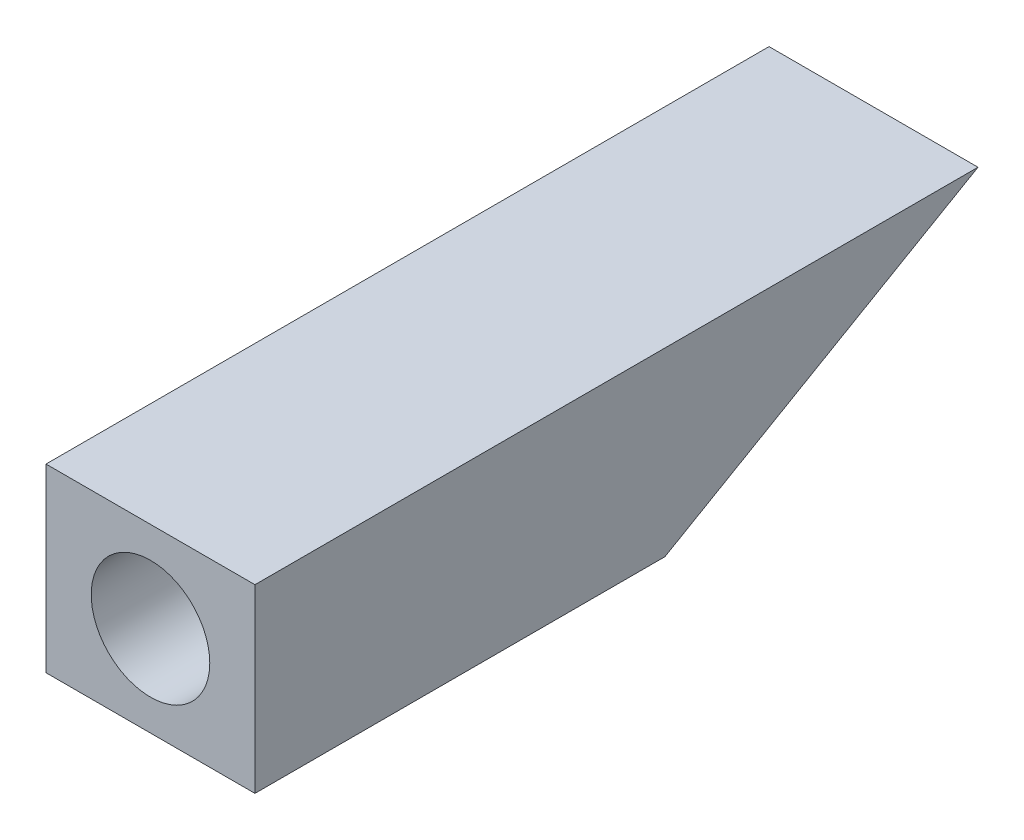
ISO-10303-21;
HEADER;
FILE_DESCRIPTION(('STEP AP214'),'2;1');
FILE_NAME('part.step','',(''),(''),'','','');
FILE_SCHEMA(('AUTOMOTIVE_DESIGN { 1 0 10303 214 1 1 1 1 }'));
ENDSEC;
DATA;
#1=APPLICATION_CONTEXT('core data for automotive mechanical design processes');
#2=APPLICATION_PROTOCOL_DEFINITION('international standard','automotive_design',2000,#1);
#3=PRODUCT_CONTEXT('',#1,'mechanical');
#4=PRODUCT('Part','Part','',(#3));
#5=PRODUCT_RELATED_PRODUCT_CATEGORY('part','',(#4));
#6=PRODUCT_DEFINITION_FORMATION('','',#4);
#7=PRODUCT_DEFINITION_CONTEXT('part definition',#1,'design');
#8=PRODUCT_DEFINITION('design','',#6,#7);
#9=PRODUCT_DEFINITION_SHAPE('','',#8);
#10=(LENGTH_UNIT() NAMED_UNIT(*) SI_UNIT(.MILLI.,.METRE.));
#11=(NAMED_UNIT(*) PLANE_ANGLE_UNIT() SI_UNIT($,.RADIAN.));
#12=(NAMED_UNIT(*) SI_UNIT($,.STERADIAN.) SOLID_ANGLE_UNIT());
#13=UNCERTAINTY_MEASURE_WITH_UNIT(LENGTH_MEASURE(1.E-05),#10,'distance_accuracy_value','');
#14=(GEOMETRIC_REPRESENTATION_CONTEXT(3) GLOBAL_UNCERTAINTY_ASSIGNED_CONTEXT((#13)) GLOBAL_UNIT_ASSIGNED_CONTEXT((#10,
#11,#12)) REPRESENTATION_CONTEXT('',''));
#15=CARTESIAN_POINT('',(0.,0.,0.));
#16=DIRECTION('',(0.,0.,1.));
#17=DIRECTION('',(1.,0.,0.));
#18=AXIS2_PLACEMENT_3D('',#15,#16,#17);
#19=CARTESIAN_POINT('',(3.6703,-3.175,25.4));
#20=DIRECTION('',(-1.,0.,0.));
#21=DIRECTION('',(0.,0.,1.));
#22=AXIS2_PLACEMENT_3D('',#19,#20,#21);
#23=PLANE('',#22);
#24=DIRECTION('',(0.,0.,-1.));
#25=VECTOR('',#24,1.);
#26=CARTESIAN_POINT('',(3.6703,-3.175,25.4));
#27=LINE('',#26,#25);
#28=CARTESIAN_POINT('',(3.6703,-3.175,25.4));
#29=VERTEX_POINT('',#28);
#30=CARTESIAN_POINT('',(3.6703,-3.175,10.9985226280625));
#31=VERTEX_POINT('',#30);
#32=EDGE_CURVE('E105',#29,#31,#27,.T.);
#33=ORIENTED_EDGE('',*,*,#32,.T.);
#34=DIRECTION('',(0.,-0.499999999999995,0.866025403784442));
#35=VECTOR('',#34,1.);
#36=CARTESIAN_POINT('',(3.6703,3.175,0.));
#37=LINE('',#36,#35);
#38=CARTESIAN_POINT('',(3.6703,3.175,0.));
#39=VERTEX_POINT('',#38);
#40=EDGE_CURVE('E89',#39,#31,#37,.T.);
#41=ORIENTED_EDGE('',*,*,#40,.F.);
#42=DIRECTION('',(0.,0.,-1.));
#43=VECTOR('',#42,1.);
#44=CARTESIAN_POINT('',(3.6703,3.175,25.4));
#45=LINE('',#44,#43);
#46=CARTESIAN_POINT('',(3.6703,3.175,25.4));
#47=VERTEX_POINT('',#46);
#48=EDGE_CURVE('E11',#47,#39,#45,.T.);
#49=ORIENTED_EDGE('',*,*,#48,.F.);
#50=DIRECTION('',(0.,1.,0.));
#51=VECTOR('',#50,1.);
#52=CARTESIAN_POINT('',(3.6703,-3.175,25.4));
#53=LINE('',#52,#51);
#54=EDGE_CURVE('E97',#29,#47,#53,.T.);
#55=ORIENTED_EDGE('',*,*,#54,.F.);
#56=EDGE_LOOP('',(#33,#41,#49,#55));
#57=FACE_BOUND('',#56,.T.);
#58=ADVANCED_FACE('F39',(#57),#23,.F.);
#59=CARTESIAN_POINT('',(-3.6703,3.175,25.4));
#60=DIRECTION('',(0.,-1.,0.));
#61=DIRECTION('',(0.,0.,-1.));
#62=AXIS2_PLACEMENT_3D('',#59,#60,#61);
#63=PLANE('',#62);
#64=DIRECTION('',(-1.,0.,0.));
#65=VECTOR('',#64,1.);
#66=CARTESIAN_POINT('',(-3.6703,3.175,0.));
#67=LINE('',#66,#65);
#68=CARTESIAN_POINT('',(-3.6703,3.175,0.));
#69=VERTEX_POINT('',#68);
#70=EDGE_CURVE('E82',#39,#69,#67,.T.);
#71=ORIENTED_EDGE('',*,*,#70,.T.);
#72=DIRECTION('',(0.,0.,-1.));
#73=VECTOR('',#72,1.);
#74=CARTESIAN_POINT('',(-3.6703,3.175,25.4));
#75=LINE('',#74,#73);
#76=CARTESIAN_POINT('',(-3.6703,3.175,25.4));
#77=VERTEX_POINT('',#76);
#78=EDGE_CURVE('E49',#77,#69,#75,.T.);
#79=ORIENTED_EDGE('',*,*,#78,.F.);
#80=DIRECTION('',(-1.,0.,0.));
#81=VECTOR('',#80,1.);
#82=CARTESIAN_POINT('',(-3.6703,3.175,25.4));
#83=LINE('',#82,#81);
#84=EDGE_CURVE('E115',#47,#77,#83,.T.);
#85=ORIENTED_EDGE('',*,*,#84,.F.);
#86=ORIENTED_EDGE('',*,*,#48,.T.);
#87=EDGE_LOOP('',(#71,#79,#85,#86));
#88=FACE_BOUND('',#87,.T.);
#89=ADVANCED_FACE('F93',(#88),#63,.F.);
#90=CARTESIAN_POINT('',(-3.6703,-3.175,25.4));
#91=DIRECTION('',(1.,0.,0.));
#92=DIRECTION('',(0.,0.,-1.));
#93=AXIS2_PLACEMENT_3D('',#90,#91,#92);
#94=PLANE('',#93);
#95=ORIENTED_EDGE('',*,*,#78,.T.);
#96=DIRECTION('',(0.,-0.499999999999995,0.866025403784442));
#97=VECTOR('',#96,1.);
#98=CARTESIAN_POINT('',(-3.6703,3.175,0.));
#99=LINE('',#98,#97);
#100=CARTESIAN_POINT('',(-3.6703,-3.175,10.9985226280625));
#101=VERTEX_POINT('',#100);
#102=EDGE_CURVE('E79',#69,#101,#99,.T.);
#103=ORIENTED_EDGE('',*,*,#102,.T.);
#104=DIRECTION('',(0.,0.,-1.));
#105=VECTOR('',#104,1.);
#106=CARTESIAN_POINT('',(-3.6703,-3.175,25.4));
#107=LINE('',#106,#105);
#108=CARTESIAN_POINT('',(-3.6703,-3.175,25.4));
#109=VERTEX_POINT('',#108);
#110=EDGE_CURVE('E102',#109,#101,#107,.T.);
#111=ORIENTED_EDGE('',*,*,#110,.F.);
#112=DIRECTION('',(0.,-1.,0.));
#113=VECTOR('',#112,1.);
#114=CARTESIAN_POINT('',(-3.6703,-3.175,25.4));
#115=LINE('',#114,#113);
#116=EDGE_CURVE('E100',#77,#109,#115,.T.);
#117=ORIENTED_EDGE('',*,*,#116,.F.);
#118=EDGE_LOOP('',(#95,#103,#111,#117));
#119=FACE_BOUND('',#118,.T.);
#120=ADVANCED_FACE('F99',(#119),#94,.F.);
#121=CARTESIAN_POINT('',(-3.6703,-3.175,25.4));
#122=DIRECTION('',(0.,1.,0.));
#123=DIRECTION('',(0.,0.,1.));
#124=AXIS2_PLACEMENT_3D('',#121,#122,#123);
#125=PLANE('',#124);
#126=ORIENTED_EDGE('',*,*,#110,.T.);
#127=DIRECTION('',(1.,0.,0.));
#128=VECTOR('',#127,1.);
#129=CARTESIAN_POINT('',(-3.6703,-3.175,10.9985226280625));
#130=LINE('',#129,#128);
#131=EDGE_CURVE('E77',#101,#31,#130,.T.);
#132=ORIENTED_EDGE('',*,*,#131,.T.);
#133=ORIENTED_EDGE('',*,*,#32,.F.);
#134=DIRECTION('',(1.,0.,0.));
#135=VECTOR('',#134,1.);
#136=CARTESIAN_POINT('',(-3.6703,-3.175,25.4));
#137=LINE('',#136,#135);
#138=EDGE_CURVE('E56',#109,#29,#137,.T.);
#139=ORIENTED_EDGE('',*,*,#138,.F.);
#140=EDGE_LOOP('',(#126,#132,#133,#139));
#141=FACE_BOUND('',#140,.T.);
#142=ADVANCED_FACE('F149',(#141),#125,.F.);
#143=CARTESIAN_POINT('',(0.,0.,25.4));
#144=DIRECTION('',(0.,0.,-1.));
#145=DIRECTION('',(-1.,0.,0.));
#146=AXIS2_PLACEMENT_3D('',#143,#144,#145);
#147=PLANE('',#146);
#148=CARTESIAN_POINT('',(0.,0.,25.4));
#149=DIRECTION('',(0.,0.,1.));
#150=DIRECTION('',(1.,0.,0.));
#151=AXIS2_PLACEMENT_3D('',#148,#149,#150);
#152=CIRCLE('',#151,2.0828);
#153=CARTESIAN_POINT('',(2.0828,0.,25.4));
#154=VERTEX_POINT('',#153);
#155=EDGE_CURVE('E124',#154,#154,#152,.T.);
#156=ORIENTED_EDGE('',*,*,#155,.F.);
#157=EDGE_LOOP('',(#156));
#158=FACE_BOUND('',#157,.T.);
#159=ORIENTED_EDGE('',*,*,#54,.T.);
#160=ORIENTED_EDGE('',*,*,#84,.T.);
#161=ORIENTED_EDGE('',*,*,#116,.T.);
#162=ORIENTED_EDGE('',*,*,#138,.T.);
#163=EDGE_LOOP('',(#159,#160,#161,#162));
#164=FACE_BOUND('',#163,.T.);
#165=ADVANCED_FACE('F140',(#158,#164),#147,.F.);
#166=CARTESIAN_POINT('',(-3.6703,3.175,0.));
#167=DIRECTION('',(0.,0.866025403784442,0.499999999999995));
#168=DIRECTION('',(0.,-0.499999999999995,0.866025403784442));
#169=AXIS2_PLACEMENT_3D('',#166,#167,#168);
#170=PLANE('',#169);
#171=CARTESIAN_POINT('',(0.,0.,5.49926131403126));
#172=DIRECTION('',(0.,0.866025403784442,0.499999999999995));
#173=DIRECTION('',(0.,-0.499999999999995,0.866025403784442));
#174=AXIS2_PLACEMENT_3D('',#171,#172,#173);
#175=ELLIPSE('',#174,4.16560000000004,2.0828);
#176=CARTESIAN_POINT('',(0.,-2.0828,9.10677673603577));
#177=VERTEX_POINT('',#176);
#178=EDGE_CURVE('E42',#177,#177,#175,.T.);
#179=ORIENTED_EDGE('',*,*,#178,.T.);
#180=EDGE_LOOP('',(#179));
#181=FACE_BOUND('',#180,.T.);
#182=ORIENTED_EDGE('',*,*,#40,.T.);
#183=ORIENTED_EDGE('',*,*,#131,.F.);
#184=ORIENTED_EDGE('',*,*,#102,.F.);
#185=ORIENTED_EDGE('',*,*,#70,.F.);
#186=EDGE_LOOP('',(#182,#183,#184,#185));
#187=FACE_BOUND('',#186,.T.);
#188=ADVANCED_FACE('F81',(#181,#187),#170,.F.);
#189=CARTESIAN_POINT('',(0.,0.,0.));
#190=DIRECTION('',(0.,0.,1.));
#191=DIRECTION('',(1.,0.,0.));
#192=AXIS2_PLACEMENT_3D('',#189,#190,#191);
#193=CYLINDRICAL_SURFACE('',#192,2.0828);
#194=ORIENTED_EDGE('',*,*,#155,.T.);
#195=EDGE_LOOP('',(#194));
#196=FACE_BOUND('',#195,.T.);
#197=ORIENTED_EDGE('',*,*,#178,.F.);
#198=EDGE_LOOP('',(#197));
#199=FACE_BOUND('',#198,.T.);
#200=ADVANCED_FACE('F134',(#196,#199),#193,.F.);
#201=CLOSED_SHELL('',(#58,#89,#120,#142,#165,#188,#200));
#202=MANIFOLD_SOLID_BREP('B2',#201);
#203=ADVANCED_BREP_SHAPE_REPRESENTATION('',(#18,#202),#14);
#204=SHAPE_DEFINITION_REPRESENTATION(#9,#203);
ENDSEC;
END-ISO-10303-21;
